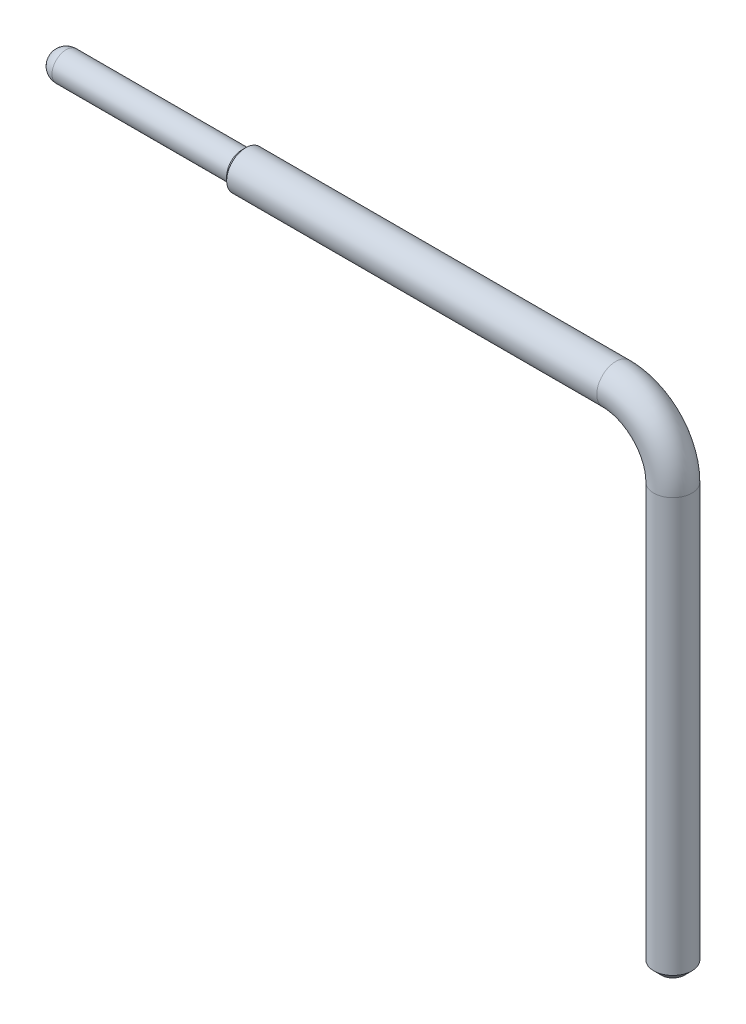
ISO-10303-21;
HEADER;
FILE_DESCRIPTION(('STEP AP214'),'2;1');
FILE_NAME('part.step','',(''),(''),'','','');
FILE_SCHEMA(('AUTOMOTIVE_DESIGN { 1 0 10303 214 1 1 1 1 }'));
ENDSEC;
DATA;
#1=APPLICATION_CONTEXT('core data for automotive mechanical design processes');
#2=APPLICATION_PROTOCOL_DEFINITION('international standard','automotive_design',2000,#1);
#3=PRODUCT_CONTEXT('',#1,'mechanical');
#4=PRODUCT('Part','Part','',(#3));
#5=PRODUCT_RELATED_PRODUCT_CATEGORY('part','',(#4));
#6=PRODUCT_DEFINITION_FORMATION('','',#4);
#7=PRODUCT_DEFINITION_CONTEXT('part definition',#1,'design');
#8=PRODUCT_DEFINITION('design','',#6,#7);
#9=PRODUCT_DEFINITION_SHAPE('','',#8);
#10=(LENGTH_UNIT() NAMED_UNIT(*) SI_UNIT(.MILLI.,.METRE.));
#11=(NAMED_UNIT(*) PLANE_ANGLE_UNIT() SI_UNIT($,.RADIAN.));
#12=(NAMED_UNIT(*) SI_UNIT($,.STERADIAN.) SOLID_ANGLE_UNIT());
#13=UNCERTAINTY_MEASURE_WITH_UNIT(LENGTH_MEASURE(1.E-05),#10,'distance_accuracy_value','');
#14=(GEOMETRIC_REPRESENTATION_CONTEXT(3) GLOBAL_UNCERTAINTY_ASSIGNED_CONTEXT((#13)) GLOBAL_UNIT_ASSIGNED_CONTEXT((#10,
#11,#12)) REPRESENTATION_CONTEXT('',''));
#15=CARTESIAN_POINT('',(0.,0.,0.));
#16=DIRECTION('',(0.,0.,1.));
#17=DIRECTION('',(1.,0.,0.));
#18=AXIS2_PLACEMENT_3D('',#15,#16,#17);
#19=CARTESIAN_POINT('',(-8.11003204,-1.03649727689614E-13,0.));
#20=DIRECTION('',(1.,0.,0.));
#21=DIRECTION('',(0.,0.,-1.));
#22=AXIS2_PLACEMENT_3D('',#19,#20,#21);
#23=SPHERICAL_SURFACE('',#22,0.19);
#24=CARTESIAN_POINT('',(-8.30003204,-1.03649727689614E-13,0.));
#25=VERTEX_POINT('',#24);
#26=VERTEX_LOOP('',#25);
#27=FACE_BOUND('',#26,.T.);
#28=CARTESIAN_POINT('',(-8.11003204,-1.03941598980205E-13,0.));
#29=DIRECTION('',(-1.,0.,0.));
#30=DIRECTION('',(0.,-1.,0.));
#31=AXIS2_PLACEMENT_3D('',#28,#29,#30);
#32=CIRCLE('',#31,0.19);
#33=CARTESIAN_POINT('',(-8.11003204,-0.190000000000104,0.));
#34=VERTEX_POINT('',#33);
#35=EDGE_CURVE('E34',#34,#34,#32,.F.);
#36=ORIENTED_EDGE('',*,*,#35,.F.);
#37=EDGE_LOOP('',(#36));
#38=FACE_BOUND('',#37,.T.);
#39=ADVANCED_FACE('F17',(#27,#38),#23,.T.);
#40=CARTESIAN_POINT('',(-5.76003204,0.,0.));
#41=DIRECTION('',(-1.,0.,0.));
#42=DIRECTION('',(0.,-1.,0.));
#43=AXIS2_PLACEMENT_3D('',#40,#41,#42);
#44=CYLINDRICAL_SURFACE('',#43,0.19);
#45=CARTESIAN_POINT('',(-5.76003204,0.,0.));
#46=DIRECTION('',(-1.,0.,0.));
#47=DIRECTION('',(0.,-1.,0.));
#48=AXIS2_PLACEMENT_3D('',#45,#46,#47);
#49=CIRCLE('',#48,0.19);
#50=CARTESIAN_POINT('',(-5.76003204,-0.190000000000071,0.));
#51=VERTEX_POINT('',#50);
#52=EDGE_CURVE('E21',#51,#51,#49,.F.);
#53=ORIENTED_EDGE('',*,*,#52,.F.);
#54=EDGE_LOOP('',(#53));
#55=FACE_BOUND('',#54,.T.);
#56=ORIENTED_EDGE('',*,*,#35,.T.);
#57=EDGE_LOOP('',(#56));
#58=FACE_BOUND('',#57,.T.);
#59=ADVANCED_FACE('F31',(#55,#58),#44,.T.);
#60=CARTESIAN_POINT('',(-5.76003203999996,-3.06917500000003,0.));
#61=DIRECTION('',(-1.,0.,0.));
#62=DIRECTION('',(0.,-1.,0.));
#63=AXIS2_PLACEMENT_3D('',#60,#61,#62);
#64=PLANE('',#63);
#65=ORIENTED_EDGE('',*,*,#52,.T.);
#66=EDGE_LOOP('',(#65));
#67=FACE_BOUND('',#66,.T.);
#68=CARTESIAN_POINT('',(-5.76003203997288,0.,0.));
#69=DIRECTION('',(1.,0.,0.));
#70=DIRECTION('',(0.,0.,-1.));
#71=AXIS2_PLACEMENT_3D('',#68,#69,#70);
#72=CIRCLE('',#71,0.204999999994016);
#73=CARTESIAN_POINT('',(-5.76003203997288,0.,-0.204999999994016));
#74=VERTEX_POINT('',#73);
#75=EDGE_CURVE('E38',#74,#74,#72,.T.);
#76=ORIENTED_EDGE('',*,*,#75,.F.);
#77=EDGE_LOOP('',(#76));
#78=FACE_BOUND('',#77,.T.);
#79=ADVANCED_FACE('F76',(#67,#78),#64,.T.);
#80=CARTESIAN_POINT('',(-5.71003203998544,0.,0.));
#81=DIRECTION('',(1.,0.,0.));
#82=DIRECTION('',(0.,0.,-1.));
#83=AXIS2_PLACEMENT_3D('',#80,#81,#82);
#84=CONICAL_SURFACE('',#83,0.254999999981464,0.785398163397448);
#85=ORIENTED_EDGE('',*,*,#75,.T.);
#86=EDGE_LOOP('',(#85));
#87=FACE_BOUND('',#86,.T.);
#88=CARTESIAN_POINT('',(-5.71003204,0.,0.));
#89=DIRECTION('',(-1.,0.,0.));
#90=DIRECTION('',(0.,-1.,0.));
#91=AXIS2_PLACEMENT_3D('',#88,#89,#90);
#92=CIRCLE('',#91,0.255);
#93=CARTESIAN_POINT('',(-5.71003204,-0.255,0.));
#94=VERTEX_POINT('',#93);
#95=EDGE_CURVE('E46',#94,#94,#92,.F.);
#96=ORIENTED_EDGE('',*,*,#95,.F.);
#97=EDGE_LOOP('',(#96));
#98=FACE_BOUND('',#97,.T.);
#99=ADVANCED_FACE('F72',(#87,#98),#84,.T.);
#100=CARTESIAN_POINT('',(-0.762000000000006,0.,0.));
#101=DIRECTION('',(-1.,0.,0.));
#102=DIRECTION('',(0.,-1.,0.));
#103=AXIS2_PLACEMENT_3D('',#100,#101,#102);
#104=CYLINDRICAL_SURFACE('',#103,0.255);
#105=CARTESIAN_POINT('',(-0.762000000000004,0.,0.));
#106=DIRECTION('',(-1.,0.,0.));
#107=DIRECTION('',(0.,1.,0.));
#108=AXIS2_PLACEMENT_3D('',#105,#106,#107);
#109=CIRCLE('',#108,0.255);
#110=CARTESIAN_POINT('',(-0.762000000000005,0.255,0.));
#111=VERTEX_POINT('',#110);
#112=EDGE_CURVE('E44',#111,#111,#109,.F.);
#113=ORIENTED_EDGE('',*,*,#112,.F.);
#114=EDGE_LOOP('',(#113));
#115=FACE_BOUND('',#114,.T.);
#116=ORIENTED_EDGE('',*,*,#95,.T.);
#117=EDGE_LOOP('',(#116));
#118=FACE_BOUND('',#117,.T.);
#119=ADVANCED_FACE('F68',(#115,#118),#104,.T.);
#120=CARTESIAN_POINT('',(0.,-6.39335,0.));
#121=DIRECTION('',(0.,1.,0.));
#122=DIRECTION('',(-1.,0.,0.));
#123=AXIS2_PLACEMENT_3D('',#120,#121,#122);
#124=PLANE('',#123);
#125=CARTESIAN_POINT('',(0.,-6.39334999999619,0.));
#126=DIRECTION('',(0.,1.,0.));
#127=DIRECTION('',(-1.,0.,0.));
#128=AXIS2_PLACEMENT_3D('',#125,#126,#127);
#129=CIRCLE('',#128,0.155000000006567);
#130=CARTESIAN_POINT('',(-0.155000000006567,-6.39334999999619,0.));
#131=VERTEX_POINT('',#130);
#132=EDGE_CURVE('E42',#131,#131,#129,.T.);
#133=ORIENTED_EDGE('',*,*,#132,.F.);
#134=EDGE_LOOP('',(#133));
#135=FACE_BOUND('',#134,.T.);
#136=ADVANCED_FACE('F63',(#135),#124,.F.);
#137=CARTESIAN_POINT('',(-0.762,-0.762,0.));
#138=DIRECTION('',(0.,0.,1.));
#139=DIRECTION('',(1.,0.,0.));
#140=AXIS2_PLACEMENT_3D('',#137,#138,#139);
#141=TOROIDAL_SURFACE('',#140,0.762,0.255);
#142=ORIENTED_EDGE('',*,*,#112,.T.);
#143=EDGE_LOOP('',(#142));
#144=FACE_BOUND('',#143,.T.);
#145=CARTESIAN_POINT('',(0.,-0.762000000000005,0.));
#146=DIRECTION('',(0.,-1.,0.));
#147=DIRECTION('',(1.,0.,0.));
#148=AXIS2_PLACEMENT_3D('',#145,#146,#147);
#149=CIRCLE('',#148,0.255);
#150=CARTESIAN_POINT('',(0.255,-0.762000000000005,0.));
#151=VERTEX_POINT('',#150);
#152=EDGE_CURVE('E25',#151,#151,#149,.T.);
#153=ORIENTED_EDGE('',*,*,#152,.F.);
#154=EDGE_LOOP('',(#153));
#155=FACE_BOUND('',#154,.T.);
#156=ADVANCED_FACE('F58',(#144,#155),#141,.T.);
#157=CARTESIAN_POINT('',(0.,-6.29335000007814,0.));
#158=DIRECTION('',(0.,1.,0.));
#159=DIRECTION('',(-1.,0.,0.));
#160=AXIS2_PLACEMENT_3D('',#157,#158,#159);
#161=CONICAL_SURFACE('',#160,0.254999999924621,0.785398163397448);
#162=CARTESIAN_POINT('',(0.,-6.29335,0.));
#163=DIRECTION('',(0.,-1.,0.));
#164=DIRECTION('',(1.,0.,0.));
#165=AXIS2_PLACEMENT_3D('',#162,#163,#164);
#166=CIRCLE('',#165,0.255);
#167=CARTESIAN_POINT('',(0.255,-6.29335,0.));
#168=VERTEX_POINT('',#167);
#169=EDGE_CURVE('E11',#168,#168,#166,.F.);
#170=ORIENTED_EDGE('',*,*,#169,.F.);
#171=EDGE_LOOP('',(#170));
#172=FACE_BOUND('',#171,.T.);
#173=ORIENTED_EDGE('',*,*,#132,.T.);
#174=EDGE_LOOP('',(#173));
#175=FACE_BOUND('',#174,.T.);
#176=ADVANCED_FACE('F62',(#172,#175),#161,.T.);
#177=CARTESIAN_POINT('',(0.,-0.762000000000005,0.));
#178=DIRECTION('',(0.,-1.,0.));
#179=DIRECTION('',(1.,0.,0.));
#180=AXIS2_PLACEMENT_3D('',#177,#178,#179);
#181=CYLINDRICAL_SURFACE('',#180,0.255);
#182=ORIENTED_EDGE('',*,*,#169,.T.);
#183=EDGE_LOOP('',(#182));
#184=FACE_BOUND('',#183,.T.);
#185=ORIENTED_EDGE('',*,*,#152,.T.);
#186=EDGE_LOOP('',(#185));
#187=FACE_BOUND('',#186,.T.);
#188=ADVANCED_FACE('F85',(#184,#187),#181,.T.);
#189=CLOSED_SHELL('',(#39,#59,#79,#99,#119,#136,#156,#176,#188));
#190=MANIFOLD_SOLID_BREP('B1',#189);
#191=ADVANCED_BREP_SHAPE_REPRESENTATION('',(#18,#190),#14);
#192=SHAPE_DEFINITION_REPRESENTATION(#9,#191);
ENDSEC;
END-ISO-10303-21;
